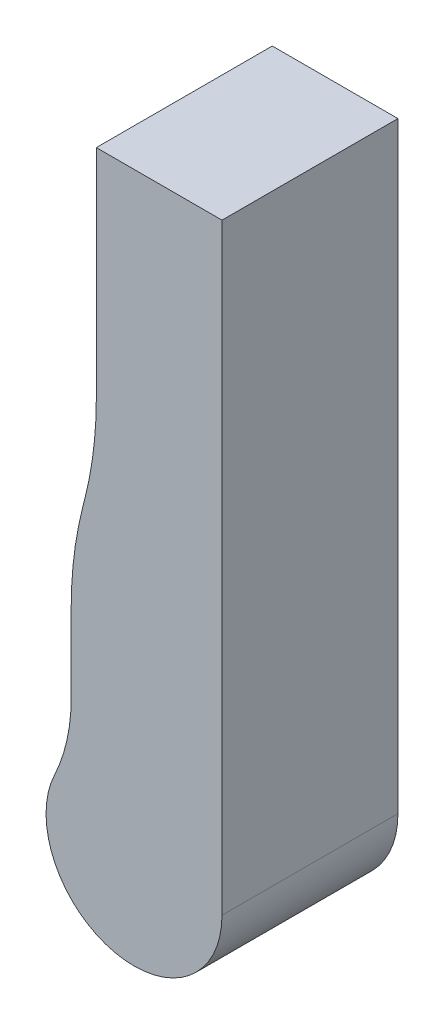
ISO-10303-21;
HEADER;
FILE_DESCRIPTION(('STEP AP214'),'2;1');
FILE_NAME('part.step','',(''),(''),'','','');
FILE_SCHEMA(('AUTOMOTIVE_DESIGN { 1 0 10303 214 1 1 1 1 }'));
ENDSEC;
DATA;
#1=APPLICATION_CONTEXT('core data for automotive mechanical design processes');
#2=APPLICATION_PROTOCOL_DEFINITION('international standard','automotive_design',2000,#1);
#3=PRODUCT_CONTEXT('',#1,'mechanical');
#4=PRODUCT('Part','Part','',(#3));
#5=PRODUCT_RELATED_PRODUCT_CATEGORY('part','',(#4));
#6=PRODUCT_DEFINITION_FORMATION('','',#4);
#7=PRODUCT_DEFINITION_CONTEXT('part definition',#1,'design');
#8=PRODUCT_DEFINITION('design','',#6,#7);
#9=PRODUCT_DEFINITION_SHAPE('','',#8);
#10=(LENGTH_UNIT() NAMED_UNIT(*) SI_UNIT(.MILLI.,.METRE.));
#11=(NAMED_UNIT(*) PLANE_ANGLE_UNIT() SI_UNIT($,.RADIAN.));
#12=(NAMED_UNIT(*) SI_UNIT($,.STERADIAN.) SOLID_ANGLE_UNIT());
#13=UNCERTAINTY_MEASURE_WITH_UNIT(LENGTH_MEASURE(1.E-05),#10,'distance_accuracy_value','');
#14=(GEOMETRIC_REPRESENTATION_CONTEXT(3) GLOBAL_UNCERTAINTY_ASSIGNED_CONTEXT((#13)) GLOBAL_UNIT_ASSIGNED_CONTEXT((#10,
#11,#12)) REPRESENTATION_CONTEXT('',''));
#15=CARTESIAN_POINT('',(0.,0.,0.));
#16=DIRECTION('',(0.,0.,1.));
#17=DIRECTION('',(1.,0.,0.));
#18=AXIS2_PLACEMENT_3D('',#15,#16,#17);
#19=CARTESIAN_POINT('',(-6.,-14.5,7.));
#20=DIRECTION('',(1.,0.,0.));
#21=DIRECTION('',(0.,1.,0.));
#22=AXIS2_PLACEMENT_3D('',#19,#20,#21);
#23=PLANE('',#22);
#24=DIRECTION('',(0.,-1.,0.));
#25=VECTOR('',#24,1.);
#26=CARTESIAN_POINT('',(-6.,-14.5,7.));
#27=LINE('',#26,#25);
#28=CARTESIAN_POINT('',(-6.,-16.3465843842649,7.));
#29=VERTEX_POINT('',#28);
#30=CARTESIAN_POINT('',(-6.,-19.4773537877836,7.));
#31=VERTEX_POINT('',#30);
#32=EDGE_CURVE('E130',#29,#31,#27,.T.);
#33=ORIENTED_EDGE('',*,*,#32,.F.);
#34=DIRECTION('',(0.,0.,-1.));
#35=VECTOR('',#34,1.);
#36=CARTESIAN_POINT('',(-6.,-16.3465843842649,0.));
#37=LINE('',#36,#35);
#38=CARTESIAN_POINT('',(-6.,-16.3465843842649,0.));
#39=VERTEX_POINT('',#38);
#40=EDGE_CURVE('E194',#29,#39,#37,.T.);
#41=ORIENTED_EDGE('',*,*,#40,.T.);
#42=DIRECTION('',(0.,-1.,0.));
#43=VECTOR('',#42,1.);
#44=CARTESIAN_POINT('',(-6.,-14.5,0.));
#45=LINE('',#44,#43);
#46=CARTESIAN_POINT('',(-6.,-19.4773537877836,0.));
#47=VERTEX_POINT('',#46);
#48=EDGE_CURVE('E159',#39,#47,#45,.T.);
#49=ORIENTED_EDGE('',*,*,#48,.T.);
#50=DIRECTION('',(0.,0.,1.));
#51=VECTOR('',#50,1.);
#52=CARTESIAN_POINT('',(-6.,-19.4773537877836,7.));
#53=LINE('',#52,#51);
#54=EDGE_CURVE('E184',#47,#31,#53,.T.);
#55=ORIENTED_EDGE('',*,*,#54,.T.);
#56=EDGE_LOOP('',(#33,#41,#49,#55));
#57=FACE_BOUND('',#56,.T.);
#58=ADVANCED_FACE('F45',(#57),#23,.F.);
#59=CARTESIAN_POINT('',(-3.5,-23.9494897427832,7.));
#60=DIRECTION('',(0.,0.,-1.));
#61=DIRECTION('',(-1.,0.,0.));
#62=AXIS2_PLACEMENT_3D('',#59,#60,#61);
#63=CYLINDRICAL_SURFACE('',#62,3.5);
#64=CARTESIAN_POINT('',(-3.5,-23.9494897427832,7.));
#65=DIRECTION('',(0.,0.,1.));
#66=DIRECTION('',(1.,0.,0.));
#67=AXIS2_PLACEMENT_3D('',#64,#65,#66);
#68=CIRCLE('',#67,3.5);
#69=CARTESIAN_POINT('',(-6.66666666666666,-22.4587777577833,7.));
#70=VERTEX_POINT('',#69);
#71=CARTESIAN_POINT('',(0.,-23.9494897427832,7.));
#72=VERTEX_POINT('',#71);
#73=EDGE_CURVE('E117',#70,#72,#68,.T.);
#74=ORIENTED_EDGE('',*,*,#73,.F.);
#75=DIRECTION('',(0.,0.,-1.));
#76=VECTOR('',#75,1.);
#77=CARTESIAN_POINT('',(-6.66666666666666,-22.4587777577833,7.));
#78=LINE('',#77,#76);
#79=CARTESIAN_POINT('',(-6.66666666666666,-22.4587777577833,0.));
#80=VERTEX_POINT('',#79);
#81=EDGE_CURVE('E141',#70,#80,#78,.T.);
#82=ORIENTED_EDGE('',*,*,#81,.T.);
#83=CARTESIAN_POINT('',(-3.5,-23.9494897427832,0.));
#84=DIRECTION('',(0.,0.,1.));
#85=DIRECTION('',(1.,0.,0.));
#86=AXIS2_PLACEMENT_3D('',#83,#84,#85);
#87=CIRCLE('',#86,3.5);
#88=CARTESIAN_POINT('',(0.,-23.9494897427832,0.));
#89=VERTEX_POINT('',#88);
#90=EDGE_CURVE('E136',#80,#89,#87,.T.);
#91=ORIENTED_EDGE('',*,*,#90,.T.);
#92=DIRECTION('',(0.,0.,-1.));
#93=VECTOR('',#92,1.);
#94=CARTESIAN_POINT('',(0.,-23.9494897427832,7.));
#95=LINE('',#94,#93);
#96=EDGE_CURVE('E133',#72,#89,#95,.T.);
#97=ORIENTED_EDGE('',*,*,#96,.F.);
#98=EDGE_LOOP('',(#74,#82,#91,#97));
#99=FACE_BOUND('',#98,.T.);
#100=ADVANCED_FACE('F134',(#99),#63,.T.);
#101=CARTESIAN_POINT('',(0.,0.,7.));
#102=DIRECTION('',(1.,0.,0.));
#103=DIRECTION('',(0.,1.,0.));
#104=AXIS2_PLACEMENT_3D('',#101,#102,#103);
#105=PLANE('',#104);
#106=DIRECTION('',(0.,-1.,0.));
#107=VECTOR('',#106,1.);
#108=CARTESIAN_POINT('',(0.,0.,0.));
#109=LINE('',#108,#107);
#110=CARTESIAN_POINT('',(0.,0.,0.));
#111=VERTEX_POINT('',#110);
#112=EDGE_CURVE('E164',#111,#89,#109,.T.);
#113=ORIENTED_EDGE('',*,*,#112,.F.);
#114=DIRECTION('',(0.,0.,-1.));
#115=VECTOR('',#114,1.);
#116=CARTESIAN_POINT('',(0.,0.,7.));
#117=LINE('',#116,#115);
#118=CARTESIAN_POINT('',(0.,0.,7.));
#119=VERTEX_POINT('',#118);
#120=EDGE_CURVE('E142',#119,#111,#117,.T.);
#121=ORIENTED_EDGE('',*,*,#120,.F.);
#122=DIRECTION('',(0.,-1.,0.));
#123=VECTOR('',#122,1.);
#124=CARTESIAN_POINT('',(0.,0.,7.));
#125=LINE('',#124,#123);
#126=EDGE_CURVE('E122',#119,#72,#125,.T.);
#127=ORIENTED_EDGE('',*,*,#126,.T.);
#128=ORIENTED_EDGE('',*,*,#96,.T.);
#129=EDGE_LOOP('',(#113,#121,#127,#128));
#130=FACE_BOUND('',#129,.T.);
#131=ADVANCED_FACE('F144',(#130),#105,.T.);
#132=CARTESIAN_POINT('',(-5.,0.,7.));
#133=DIRECTION('',(0.,1.,0.));
#134=DIRECTION('',(0.,0.,1.));
#135=AXIS2_PLACEMENT_3D('',#132,#133,#134);
#136=PLANE('',#135);
#137=DIRECTION('',(1.,0.,0.));
#138=VECTOR('',#137,1.);
#139=CARTESIAN_POINT('',(-5.,0.,0.));
#140=LINE('',#139,#138);
#141=CARTESIAN_POINT('',(-5.,0.,0.));
#142=VERTEX_POINT('',#141);
#143=EDGE_CURVE('E167',#142,#111,#140,.T.);
#144=ORIENTED_EDGE('',*,*,#143,.F.);
#145=DIRECTION('',(0.,0.,-1.));
#146=VECTOR('',#145,1.);
#147=CARTESIAN_POINT('',(-5.,0.,7.));
#148=LINE('',#147,#146);
#149=CARTESIAN_POINT('',(-5.,0.,7.));
#150=VERTEX_POINT('',#149);
#151=EDGE_CURVE('E158',#150,#142,#148,.T.);
#152=ORIENTED_EDGE('',*,*,#151,.F.);
#153=DIRECTION('',(1.,0.,0.));
#154=VECTOR('',#153,1.);
#155=CARTESIAN_POINT('',(-5.,0.,7.));
#156=LINE('',#155,#154);
#157=EDGE_CURVE('E146',#150,#119,#156,.T.);
#158=ORIENTED_EDGE('',*,*,#157,.T.);
#159=ORIENTED_EDGE('',*,*,#120,.T.);
#160=EDGE_LOOP('',(#144,#152,#158,#159));
#161=FACE_BOUND('',#160,.T.);
#162=ADVANCED_FACE('F251',(#161),#136,.T.);
#163=CARTESIAN_POINT('',(-5.,0.,7.));
#164=DIRECTION('',(1.,0.,0.));
#165=DIRECTION('',(0.,1.,0.));
#166=AXIS2_PLACEMENT_3D('',#163,#164,#165);
#167=PLANE('',#166);
#168=DIRECTION('',(0.,-1.,0.));
#169=VECTOR('',#168,1.);
#170=CARTESIAN_POINT('',(-5.,0.,0.));
#171=LINE('',#170,#169);
#172=CARTESIAN_POINT('',(-5.,-8.65341561573508,0.));
#173=VERTEX_POINT('',#172);
#174=EDGE_CURVE('E171',#142,#173,#171,.T.);
#175=ORIENTED_EDGE('',*,*,#174,.T.);
#176=DIRECTION('',(0.,0.,-1.));
#177=VECTOR('',#176,1.);
#178=CARTESIAN_POINT('',(-5.,-8.65341561573508,7.));
#179=LINE('',#178,#177);
#180=CARTESIAN_POINT('',(-5.,-8.65341561573508,7.));
#181=VERTEX_POINT('',#180);
#182=EDGE_CURVE('E61',#173,#181,#179,.F.);
#183=ORIENTED_EDGE('',*,*,#182,.T.);
#184=DIRECTION('',(0.,-1.,0.));
#185=VECTOR('',#184,1.);
#186=CARTESIAN_POINT('',(-5.,0.,7.));
#187=LINE('',#186,#185);
#188=EDGE_CURVE('E149',#150,#181,#187,.T.);
#189=ORIENTED_EDGE('',*,*,#188,.F.);
#190=ORIENTED_EDGE('',*,*,#151,.T.);
#191=EDGE_LOOP('',(#175,#183,#189,#190));
#192=FACE_BOUND('',#191,.T.);
#193=ADVANCED_FACE('F221',(#192),#167,.F.);
#194=CARTESIAN_POINT('',(-6.,-14.5,7.));
#195=DIRECTION('',(-0.970142500145332,0.242535625036333,0.));
#196=DIRECTION('',(-0.242535625036333,-0.970142500145332,0.));
#197=AXIS2_PLACEMENT_3D('',#194,#195,#196);
#198=PLANE('',#197);
#199=DIRECTION('',(0.242535625036333,0.970142500145332,0.));
#200=VECTOR('',#199,1.);
#201=CARTESIAN_POINT('',(-6.,-14.5,0.));
#202=LINE('',#201,#200);
#203=CARTESIAN_POINT('',(-5.55213750217998,-12.7085500087199,0.));
#204=VERTEX_POINT('',#203);
#205=CARTESIAN_POINT('',(-5.44786249782002,-12.2914499912801,0.));
#206=VERTEX_POINT('',#205);
#207=EDGE_CURVE('E174',#204,#206,#202,.T.);
#208=ORIENTED_EDGE('',*,*,#207,.F.);
#209=DIRECTION('',(0.,0.,-1.));
#210=VECTOR('',#209,1.);
#211=CARTESIAN_POINT('',(-5.55213750217998,-12.7085500087199,7.));
#212=LINE('',#211,#210);
#213=CARTESIAN_POINT('',(-5.55213750217998,-12.7085500087199,7.));
#214=VERTEX_POINT('',#213);
#215=EDGE_CURVE('E205',#204,#214,#212,.F.);
#216=ORIENTED_EDGE('',*,*,#215,.T.);
#217=DIRECTION('',(0.242535625036333,0.970142500145332,0.));
#218=VECTOR('',#217,1.);
#219=CARTESIAN_POINT('',(-6.,-14.5,7.));
#220=LINE('',#219,#218);
#221=CARTESIAN_POINT('',(-5.44786249782002,-12.2914499912801,7.));
#222=VERTEX_POINT('',#221);
#223=EDGE_CURVE('E155',#214,#222,#220,.T.);
#224=ORIENTED_EDGE('',*,*,#223,.T.);
#225=DIRECTION('',(0.,0.,-1.));
#226=VECTOR('',#225,1.);
#227=CARTESIAN_POINT('',(-5.44786249782002,-12.2914499912801,7.));
#228=LINE('',#227,#226);
#229=EDGE_CURVE('E201',#222,#206,#228,.T.);
#230=ORIENTED_EDGE('',*,*,#229,.T.);
#231=EDGE_LOOP('',(#208,#216,#224,#230));
#232=FACE_BOUND('',#231,.T.);
#233=ADVANCED_FACE('F223',(#232),#198,.T.);
#234=CARTESIAN_POINT('',(-3.5,-23.9494897427832,7.));
#235=DIRECTION('',(0.,0.,1.));
#236=DIRECTION('',(1.,0.,0.));
#237=AXIS2_PLACEMENT_3D('',#234,#235,#236);
#238=PLANE('',#237);
#239=ORIENTED_EDGE('',*,*,#223,.F.);
#240=CARTESIAN_POINT('',(9.,-16.3465843842649,7.));
#241=DIRECTION('',(0.,0.,1.));
#242=DIRECTION('',(1.,0.,0.));
#243=AXIS2_PLACEMENT_3D('',#240,#241,#242);
#244=CIRCLE('',#243,15.);
#245=EDGE_CURVE('E208',#214,#29,#244,.T.);
#246=ORIENTED_EDGE('',*,*,#245,.T.);
#247=ORIENTED_EDGE('',*,*,#32,.T.);
#248=CARTESIAN_POINT('',(-13.,-19.4773537877836,7.));
#249=DIRECTION('',(0.,0.,1.));
#250=DIRECTION('',(1.,0.,0.));
#251=AXIS2_PLACEMENT_3D('',#248,#249,#250);
#252=CIRCLE('',#251,7.);
#253=EDGE_CURVE('E125',#31,#70,#252,.F.);
#254=ORIENTED_EDGE('',*,*,#253,.T.);
#255=ORIENTED_EDGE('',*,*,#73,.T.);
#256=ORIENTED_EDGE('',*,*,#126,.F.);
#257=ORIENTED_EDGE('',*,*,#157,.F.);
#258=ORIENTED_EDGE('',*,*,#188,.T.);
#259=CARTESIAN_POINT('',(-20.,-8.65341561573508,7.));
#260=DIRECTION('',(0.,0.,1.));
#261=DIRECTION('',(1.,0.,0.));
#262=AXIS2_PLACEMENT_3D('',#259,#260,#261);
#263=CIRCLE('',#262,15.);
#264=EDGE_CURVE('E11',#181,#222,#263,.F.);
#265=ORIENTED_EDGE('',*,*,#264,.T.);
#266=EDGE_LOOP('',(#239,#246,#247,#254,#255,#256,#257,#258,#265));
#267=FACE_BOUND('',#266,.T.);
#268=ADVANCED_FACE('F119',(#267),#238,.T.);
#269=CARTESIAN_POINT('',(-3.5,-23.9494897427832,0.));
#270=DIRECTION('',(0.,0.,1.));
#271=DIRECTION('',(1.,0.,0.));
#272=AXIS2_PLACEMENT_3D('',#269,#270,#271);
#273=PLANE('',#272);
#274=ORIENTED_EDGE('',*,*,#48,.F.);
#275=CARTESIAN_POINT('',(9.,-16.3465843842649,0.));
#276=DIRECTION('',(0.,0.,1.));
#277=DIRECTION('',(1.,0.,0.));
#278=AXIS2_PLACEMENT_3D('',#275,#276,#277);
#279=CIRCLE('',#278,15.);
#280=EDGE_CURVE('E198',#39,#204,#279,.F.);
#281=ORIENTED_EDGE('',*,*,#280,.T.);
#282=ORIENTED_EDGE('',*,*,#207,.T.);
#283=CARTESIAN_POINT('',(-20.,-8.65341561573508,0.));
#284=DIRECTION('',(0.,0.,1.));
#285=DIRECTION('',(1.,0.,0.));
#286=AXIS2_PLACEMENT_3D('',#283,#284,#285);
#287=CIRCLE('',#286,15.);
#288=EDGE_CURVE('E54',#206,#173,#287,.T.);
#289=ORIENTED_EDGE('',*,*,#288,.T.);
#290=ORIENTED_EDGE('',*,*,#174,.F.);
#291=ORIENTED_EDGE('',*,*,#143,.T.);
#292=ORIENTED_EDGE('',*,*,#112,.T.);
#293=ORIENTED_EDGE('',*,*,#90,.F.);
#294=CARTESIAN_POINT('',(-13.,-19.4773537877836,0.));
#295=DIRECTION('',(0.,0.,1.));
#296=DIRECTION('',(1.,0.,0.));
#297=AXIS2_PLACEMENT_3D('',#294,#295,#296);
#298=CIRCLE('',#297,7.);
#299=EDGE_CURVE('E188',#80,#47,#298,.T.);
#300=ORIENTED_EDGE('',*,*,#299,.T.);
#301=EDGE_LOOP('',(#274,#281,#282,#289,#290,#291,#292,#293,#300));
#302=FACE_BOUND('',#301,.T.);
#303=ADVANCED_FACE('F216',(#302),#273,.F.);
#304=CARTESIAN_POINT('',(-13.,-19.4773537877836,7.));
#305=DIRECTION('',(0.,0.,-1.));
#306=DIRECTION('',(-1.,0.,0.));
#307=AXIS2_PLACEMENT_3D('',#304,#305,#306);
#308=CYLINDRICAL_SURFACE('',#307,7.);
#309=ORIENTED_EDGE('',*,*,#253,.F.);
#310=ORIENTED_EDGE('',*,*,#54,.F.);
#311=ORIENTED_EDGE('',*,*,#299,.F.);
#312=ORIENTED_EDGE('',*,*,#81,.F.);
#313=EDGE_LOOP('',(#309,#310,#311,#312));
#314=FACE_BOUND('',#313,.T.);
#315=ADVANCED_FACE('F233',(#314),#308,.F.);
#316=CARTESIAN_POINT('',(9.,-16.3465843842649,7.));
#317=DIRECTION('',(0.,0.,1.));
#318=DIRECTION('',(1.,0.,0.));
#319=AXIS2_PLACEMENT_3D('',#316,#317,#318);
#320=CYLINDRICAL_SURFACE('',#319,15.);
#321=ORIENTED_EDGE('',*,*,#245,.F.);
#322=ORIENTED_EDGE('',*,*,#215,.F.);
#323=ORIENTED_EDGE('',*,*,#280,.F.);
#324=ORIENTED_EDGE('',*,*,#40,.F.);
#325=EDGE_LOOP('',(#321,#322,#323,#324));
#326=FACE_BOUND('',#325,.T.);
#327=ADVANCED_FACE('F229',(#326),#320,.T.);
#328=CARTESIAN_POINT('',(-20.,-8.65341561573508,7.));
#329=DIRECTION('',(0.,0.,-1.));
#330=DIRECTION('',(-1.,0.,0.));
#331=AXIS2_PLACEMENT_3D('',#328,#329,#330);
#332=CYLINDRICAL_SURFACE('',#331,15.);
#333=ORIENTED_EDGE('',*,*,#264,.F.);
#334=ORIENTED_EDGE('',*,*,#182,.F.);
#335=ORIENTED_EDGE('',*,*,#288,.F.);
#336=ORIENTED_EDGE('',*,*,#229,.F.);
#337=EDGE_LOOP('',(#333,#334,#335,#336));
#338=FACE_BOUND('',#337,.T.);
#339=ADVANCED_FACE('F47',(#338),#332,.F.);
#340=CLOSED_SHELL('',(#58,#100,#131,#162,#193,#233,#268,#303,#315,#327,#339));
#341=MANIFOLD_SOLID_BREP('B2',#340);
#342=ADVANCED_BREP_SHAPE_REPRESENTATION('',(#18,#341),#14);
#343=SHAPE_DEFINITION_REPRESENTATION(#9,#342);
ENDSEC;
END-ISO-10303-21;
